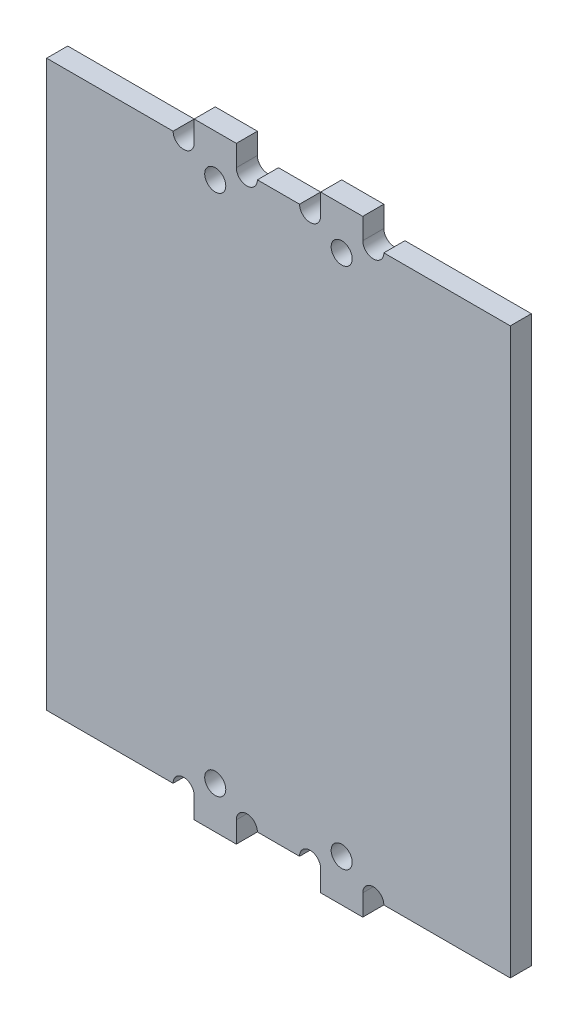
ISO-10303-21;
HEADER;
FILE_DESCRIPTION(('STEP AP214'),'2;1');
FILE_NAME('part.step','',(''),(''),'','','');
FILE_SCHEMA(('AUTOMOTIVE_DESIGN { 1 0 10303 214 1 1 1 1 }'));
ENDSEC;
DATA;
#1=APPLICATION_CONTEXT('core data for automotive mechanical design processes');
#2=APPLICATION_PROTOCOL_DEFINITION('international standard','automotive_design',2000,#1);
#3=PRODUCT_CONTEXT('',#1,'mechanical');
#4=PRODUCT('Part','Part','',(#3));
#5=PRODUCT_RELATED_PRODUCT_CATEGORY('part','',(#4));
#6=PRODUCT_DEFINITION_FORMATION('','',#4);
#7=PRODUCT_DEFINITION_CONTEXT('part definition',#1,'design');
#8=PRODUCT_DEFINITION('design','',#6,#7);
#9=PRODUCT_DEFINITION_SHAPE('','',#8);
#10=(LENGTH_UNIT() NAMED_UNIT(*) SI_UNIT(.MILLI.,.METRE.));
#11=(NAMED_UNIT(*) PLANE_ANGLE_UNIT() SI_UNIT($,.RADIAN.));
#12=(NAMED_UNIT(*) SI_UNIT($,.STERADIAN.) SOLID_ANGLE_UNIT());
#13=UNCERTAINTY_MEASURE_WITH_UNIT(LENGTH_MEASURE(1.E-05),#10,'distance_accuracy_value','');
#14=(GEOMETRIC_REPRESENTATION_CONTEXT(3) GLOBAL_UNCERTAINTY_ASSIGNED_CONTEXT((#13)) GLOBAL_UNIT_ASSIGNED_CONTEXT((#10,
#11,#12)) REPRESENTATION_CONTEXT('',''));
#15=CARTESIAN_POINT('',(0.,0.,0.));
#16=DIRECTION('',(0.,0.,1.));
#17=DIRECTION('',(1.,0.,0.));
#18=AXIS2_PLACEMENT_3D('',#15,#16,#17);
#19=CARTESIAN_POINT('',(-0.655498480536135,26.9798263842106,2.));
#20=DIRECTION('',(0.,0.,-1.));
#21=DIRECTION('',(-1.,0.,0.));
#22=AXIS2_PLACEMENT_3D('',#19,#20,#21);
#23=PLANE('',#22);
#24=DIRECTION('',(-1.,0.,0.));
#25=VECTOR('',#24,1.);
#26=CARTESIAN_POINT('',(-13.6554984805362,26.9798263842106,2.));
#27=LINE('',#26,#25);
#28=CARTESIAN_POINT('',(-1.65549848053614,26.9798263842106,2.));
#29=VERTEX_POINT('',#28);
#30=CARTESIAN_POINT('',(-13.6554984805362,26.9798263842106,2.));
#31=VERTEX_POINT('',#30);
#32=EDGE_CURVE('E49',#29,#31,#27,.T.);
#33=ORIENTED_EDGE('',*,*,#32,.T.);
#34=DIRECTION('',(0.,-1.,0.));
#35=VECTOR('',#34,1.);
#36=CARTESIAN_POINT('',(-13.6554984805362,25.9798263842106,2.));
#37=LINE('',#36,#35);
#38=CARTESIAN_POINT('',(-13.6554984805361,-26.6201736157894,2.));
#39=VERTEX_POINT('',#38);
#40=EDGE_CURVE('E153',#31,#39,#37,.T.);
#41=ORIENTED_EDGE('',*,*,#40,.T.);
#42=DIRECTION('',(1.,0.,0.));
#43=VECTOR('',#42,1.);
#44=CARTESIAN_POINT('',(-13.6554984805361,-26.6201736157894,2.));
#45=LINE('',#44,#43);
#46=CARTESIAN_POINT('',(-1.6554984805362,-26.6201736157894,2.));
#47=VERTEX_POINT('',#46);
#48=EDGE_CURVE('E385',#39,#47,#45,.T.);
#49=ORIENTED_EDGE('',*,*,#48,.T.);
#50=CARTESIAN_POINT('',(-0.655498480536205,-26.6201736157894,2.));
#51=DIRECTION('',(0.,0.,-1.));
#52=DIRECTION('',(1.,0.,0.));
#53=AXIS2_PLACEMENT_3D('',#50,#51,#52);
#54=CIRCLE('',#53,1.);
#55=CARTESIAN_POINT('',(0.344501519463795,-26.6201736157894,2.));
#56=VERTEX_POINT('',#55);
#57=EDGE_CURVE('E400',#47,#56,#54,.T.);
#58=ORIENTED_EDGE('',*,*,#57,.T.);
#59=DIRECTION('',(0.,-1.,0.));
#60=VECTOR('',#59,1.);
#61=CARTESIAN_POINT('',(0.344501519463795,-26.6201736157894,2.));
#62=LINE('',#61,#60);
#63=CARTESIAN_POINT('',(0.344501519463795,-28.6201736157894,2.));
#64=VERTEX_POINT('',#63);
#65=EDGE_CURVE('E402',#56,#64,#62,.T.);
#66=ORIENTED_EDGE('',*,*,#65,.T.);
#67=DIRECTION('',(1.,0.,0.));
#68=VECTOR('',#67,1.);
#69=CARTESIAN_POINT('',(0.344501519463795,-28.6201736157894,2.));
#70=LINE('',#69,#68);
#71=CARTESIAN_POINT('',(4.3445015194638,-28.6201736157894,2.));
#72=VERTEX_POINT('',#71);
#73=EDGE_CURVE('E404',#64,#72,#70,.T.);
#74=ORIENTED_EDGE('',*,*,#73,.T.);
#75=DIRECTION('',(0.,1.,0.));
#76=VECTOR('',#75,1.);
#77=CARTESIAN_POINT('',(4.3445015194638,-26.6201736157894,2.));
#78=LINE('',#77,#76);
#79=CARTESIAN_POINT('',(4.3445015194638,-26.6201736157894,2.));
#80=VERTEX_POINT('',#79);
#81=EDGE_CURVE('E406',#72,#80,#78,.T.);
#82=ORIENTED_EDGE('',*,*,#81,.T.);
#83=CARTESIAN_POINT('',(5.3445015194638,-26.6201736157894,2.));
#84=DIRECTION('',(0.,0.,-1.));
#85=DIRECTION('',(-1.,0.,0.));
#86=AXIS2_PLACEMENT_3D('',#83,#84,#85);
#87=CIRCLE('',#86,1.);
#88=CARTESIAN_POINT('',(6.3445015194638,-26.6201736157894,2.));
#89=VERTEX_POINT('',#88);
#90=EDGE_CURVE('E408',#80,#89,#87,.T.);
#91=ORIENTED_EDGE('',*,*,#90,.T.);
#92=DIRECTION('',(1.,0.,0.));
#93=VECTOR('',#92,1.);
#94=CARTESIAN_POINT('',(6.3445015194638,-26.6201736157894,2.));
#95=LINE('',#94,#93);
#96=CARTESIAN_POINT('',(10.3445015194638,-26.6201736157894,2.));
#97=VERTEX_POINT('',#96);
#98=EDGE_CURVE('E410',#89,#97,#95,.T.);
#99=ORIENTED_EDGE('',*,*,#98,.T.);
#100=CARTESIAN_POINT('',(11.3445015194638,-26.6201736157894,2.));
#101=DIRECTION('',(0.,0.,-1.));
#102=DIRECTION('',(1.,0.,0.));
#103=AXIS2_PLACEMENT_3D('',#100,#101,#102);
#104=CIRCLE('',#103,1.);
#105=CARTESIAN_POINT('',(12.3445015194638,-26.6201736157894,2.));
#106=VERTEX_POINT('',#105);
#107=EDGE_CURVE('E412',#97,#106,#104,.T.);
#108=ORIENTED_EDGE('',*,*,#107,.T.);
#109=DIRECTION('',(0.,-1.,0.));
#110=VECTOR('',#109,1.);
#111=CARTESIAN_POINT('',(12.3445015194638,-26.6201736157894,2.));
#112=LINE('',#111,#110);
#113=CARTESIAN_POINT('',(12.3445015194638,-28.6201736157894,2.));
#114=VERTEX_POINT('',#113);
#115=EDGE_CURVE('E414',#106,#114,#112,.T.);
#116=ORIENTED_EDGE('',*,*,#115,.T.);
#117=DIRECTION('',(1.,0.,0.));
#118=VECTOR('',#117,1.);
#119=CARTESIAN_POINT('',(12.3445015194638,-28.6201736157894,2.));
#120=LINE('',#119,#118);
#121=CARTESIAN_POINT('',(16.3445015194638,-28.6201736157894,2.));
#122=VERTEX_POINT('',#121);
#123=EDGE_CURVE('E416',#114,#122,#120,.T.);
#124=ORIENTED_EDGE('',*,*,#123,.T.);
#125=DIRECTION('',(0.,1.,0.));
#126=VECTOR('',#125,1.);
#127=CARTESIAN_POINT('',(16.3445015194638,-26.6201736157894,2.));
#128=LINE('',#127,#126);
#129=CARTESIAN_POINT('',(16.3445015194638,-26.6201736157894,2.));
#130=VERTEX_POINT('',#129);
#131=EDGE_CURVE('E418',#122,#130,#128,.T.);
#132=ORIENTED_EDGE('',*,*,#131,.T.);
#133=CARTESIAN_POINT('',(17.3445015194638,-26.6201736157894,2.));
#134=DIRECTION('',(0.,0.,-1.));
#135=DIRECTION('',(-1.,0.,0.));
#136=AXIS2_PLACEMENT_3D('',#133,#134,#135);
#137=CIRCLE('',#136,1.);
#138=CARTESIAN_POINT('',(18.3445015194638,-26.6201736157894,2.));
#139=VERTEX_POINT('',#138);
#140=EDGE_CURVE('E420',#130,#139,#137,.T.);
#141=ORIENTED_EDGE('',*,*,#140,.T.);
#142=DIRECTION('',(1.,0.,0.));
#143=VECTOR('',#142,1.);
#144=CARTESIAN_POINT('',(18.3445015194638,-26.6201736157894,2.));
#145=LINE('',#144,#143);
#146=CARTESIAN_POINT('',(30.3445015194639,-26.6201736157894,2.));
#147=VERTEX_POINT('',#146);
#148=EDGE_CURVE('E422',#139,#147,#145,.T.);
#149=ORIENTED_EDGE('',*,*,#148,.T.);
#150=DIRECTION('',(0.,1.,0.));
#151=VECTOR('',#150,1.);
#152=CARTESIAN_POINT('',(30.3445015194639,25.9798263842106,2.));
#153=LINE('',#152,#151);
#154=CARTESIAN_POINT('',(30.3445015194639,26.9798263842106,2.));
#155=VERTEX_POINT('',#154);
#156=EDGE_CURVE('E424',#147,#155,#153,.T.);
#157=ORIENTED_EDGE('',*,*,#156,.T.);
#158=DIRECTION('',(-1.,0.,0.));
#159=VECTOR('',#158,1.);
#160=CARTESIAN_POINT('',(30.3445015194639,26.9798263842106,2.));
#161=LINE('',#160,#159);
#162=CARTESIAN_POINT('',(18.3445015194639,26.9798263842106,2.));
#163=VERTEX_POINT('',#162);
#164=EDGE_CURVE('E426',#155,#163,#161,.T.);
#165=ORIENTED_EDGE('',*,*,#164,.T.);
#166=CARTESIAN_POINT('',(17.3445015194639,26.9798263842106,2.));
#167=DIRECTION('',(0.,0.,-1.));
#168=DIRECTION('',(1.,0.,0.));
#169=AXIS2_PLACEMENT_3D('',#166,#167,#168);
#170=CIRCLE('',#169,0.999999999999999);
#171=CARTESIAN_POINT('',(16.3445015194639,26.9798263842106,2.));
#172=VERTEX_POINT('',#171);
#173=EDGE_CURVE('E428',#163,#172,#170,.T.);
#174=ORIENTED_EDGE('',*,*,#173,.T.);
#175=DIRECTION('',(0.,1.,0.));
#176=VECTOR('',#175,1.);
#177=CARTESIAN_POINT('',(16.3445015194639,26.9798263842106,2.));
#178=LINE('',#177,#176);
#179=CARTESIAN_POINT('',(16.3445015194639,28.9798263842106,2.));
#180=VERTEX_POINT('',#179);
#181=EDGE_CURVE('E430',#172,#180,#178,.T.);
#182=ORIENTED_EDGE('',*,*,#181,.T.);
#183=DIRECTION('',(-1.,0.,0.));
#184=VECTOR('',#183,1.);
#185=CARTESIAN_POINT('',(12.3445015194639,28.9798263842106,2.));
#186=LINE('',#185,#184);
#187=CARTESIAN_POINT('',(12.3445015194639,28.9798263842106,2.));
#188=VERTEX_POINT('',#187);
#189=EDGE_CURVE('E432',#180,#188,#186,.T.);
#190=ORIENTED_EDGE('',*,*,#189,.T.);
#191=DIRECTION('',(0.,-1.,0.));
#192=VECTOR('',#191,1.);
#193=CARTESIAN_POINT('',(12.3445015194639,26.9798263842106,2.));
#194=LINE('',#193,#192);
#195=CARTESIAN_POINT('',(12.3445015194639,26.9798263842106,2.));
#196=VERTEX_POINT('',#195);
#197=EDGE_CURVE('E434',#188,#196,#194,.T.);
#198=ORIENTED_EDGE('',*,*,#197,.T.);
#199=CARTESIAN_POINT('',(11.3445015194639,26.9798263842106,2.));
#200=DIRECTION('',(0.,0.,-1.));
#201=DIRECTION('',(-1.,0.,0.));
#202=AXIS2_PLACEMENT_3D('',#199,#200,#201);
#203=CIRCLE('',#202,1.);
#204=CARTESIAN_POINT('',(10.3445015194639,26.9798263842106,2.));
#205=VERTEX_POINT('',#204);
#206=EDGE_CURVE('E436',#196,#205,#203,.T.);
#207=ORIENTED_EDGE('',*,*,#206,.T.);
#208=DIRECTION('',(-1.,0.,0.));
#209=VECTOR('',#208,1.);
#210=CARTESIAN_POINT('',(6.34450151946386,26.9798263842106,2.));
#211=LINE('',#210,#209);
#212=CARTESIAN_POINT('',(6.34450151946386,26.9798263842106,2.));
#213=VERTEX_POINT('',#212);
#214=EDGE_CURVE('E438',#205,#213,#211,.T.);
#215=ORIENTED_EDGE('',*,*,#214,.T.);
#216=CARTESIAN_POINT('',(5.34450151946386,26.9798263842106,2.));
#217=DIRECTION('',(0.,0.,-1.));
#218=DIRECTION('',(1.,0.,0.));
#219=AXIS2_PLACEMENT_3D('',#216,#217,#218);
#220=CIRCLE('',#219,1.);
#221=CARTESIAN_POINT('',(4.34450151946386,26.9798263842106,2.));
#222=VERTEX_POINT('',#221);
#223=EDGE_CURVE('E440',#213,#222,#220,.T.);
#224=ORIENTED_EDGE('',*,*,#223,.T.);
#225=DIRECTION('',(0.,1.,0.));
#226=VECTOR('',#225,1.);
#227=CARTESIAN_POINT('',(4.34450151946386,26.9798263842106,2.));
#228=LINE('',#227,#226);
#229=CARTESIAN_POINT('',(4.34450151946386,28.9798263842106,2.));
#230=VERTEX_POINT('',#229);
#231=EDGE_CURVE('E233',#222,#230,#228,.T.);
#232=ORIENTED_EDGE('',*,*,#231,.T.);
#233=DIRECTION('',(-1.,0.,0.));
#234=VECTOR('',#233,1.);
#235=CARTESIAN_POINT('',(0.344501519463865,28.9798263842106,2.));
#236=LINE('',#235,#234);
#237=CARTESIAN_POINT('',(0.344501519463865,28.9798263842106,2.));
#238=VERTEX_POINT('',#237);
#239=EDGE_CURVE('E227',#230,#238,#236,.T.);
#240=ORIENTED_EDGE('',*,*,#239,.T.);
#241=DIRECTION('',(0.,-1.,0.));
#242=VECTOR('',#241,1.);
#243=CARTESIAN_POINT('',(0.344501519463865,26.9798263842106,2.));
#244=LINE('',#243,#242);
#245=CARTESIAN_POINT('',(0.344501519463865,26.9798263842106,2.));
#246=VERTEX_POINT('',#245);
#247=EDGE_CURVE('E231',#238,#246,#244,.T.);
#248=ORIENTED_EDGE('',*,*,#247,.T.);
#249=CARTESIAN_POINT('',(-0.655498480536135,26.9798263842106,2.));
#250=DIRECTION('',(0.,0.,-1.));
#251=DIRECTION('',(-1.,0.,0.));
#252=AXIS2_PLACEMENT_3D('',#249,#250,#251);
#253=CIRCLE('',#252,1.);
#254=EDGE_CURVE('E247',#246,#29,#253,.T.);
#255=ORIENTED_EDGE('',*,*,#254,.T.);
#256=EDGE_LOOP('',(#33,#41,#49,#58,#66,#74,#82,#91,#99,#108,#116,#124,#132,#141,#149,#157,#165,
#174,#182,#190,#198,#207,#215,#224,#232,#240,#248,#255));
#257=FACE_BOUND('',#256,.T.);
#258=CARTESIAN_POINT('',(2.34450151946386,24.9798263842106,2.));
#259=DIRECTION('',(0.,0.,1.));
#260=DIRECTION('',(1.,0.,0.));
#261=AXIS2_PLACEMENT_3D('',#258,#259,#260);
#262=CIRCLE('',#261,1.);
#263=CARTESIAN_POINT('',(3.34450151946387,24.9798263842106,2.));
#264=VERTEX_POINT('',#263);
#265=EDGE_CURVE('E257',#264,#264,#262,.T.);
#266=ORIENTED_EDGE('',*,*,#265,.F.);
#267=EDGE_LOOP('',(#266));
#268=FACE_BOUND('',#267,.T.);
#269=CARTESIAN_POINT('',(2.34450151946386,-24.6201736157894,2.));
#270=DIRECTION('',(0.,0.,1.));
#271=DIRECTION('',(1.,0.,0.));
#272=AXIS2_PLACEMENT_3D('',#269,#270,#271);
#273=CIRCLE('',#272,1.);
#274=CARTESIAN_POINT('',(3.34450151946387,-24.6201736157894,2.));
#275=VERTEX_POINT('',#274);
#276=EDGE_CURVE('E860',#275,#275,#273,.T.);
#277=ORIENTED_EDGE('',*,*,#276,.F.);
#278=EDGE_LOOP('',(#277));
#279=FACE_BOUND('',#278,.T.);
#280=CARTESIAN_POINT('',(14.3445015194639,-24.6201736157894,2.));
#281=DIRECTION('',(0.,0.,1.));
#282=DIRECTION('',(1.,0.,0.));
#283=AXIS2_PLACEMENT_3D('',#280,#281,#282);
#284=CIRCLE('',#283,1.);
#285=CARTESIAN_POINT('',(15.3445015194639,-24.6201736157894,2.));
#286=VERTEX_POINT('',#285);
#287=EDGE_CURVE('E854',#286,#286,#284,.T.);
#288=ORIENTED_EDGE('',*,*,#287,.F.);
#289=EDGE_LOOP('',(#288));
#290=FACE_BOUND('',#289,.T.);
#291=CARTESIAN_POINT('',(14.3445015194639,24.9798263842106,2.));
#292=DIRECTION('',(0.,0.,1.));
#293=DIRECTION('',(1.,0.,0.));
#294=AXIS2_PLACEMENT_3D('',#291,#292,#293);
#295=CIRCLE('',#294,1.);
#296=CARTESIAN_POINT('',(15.3445015194639,24.9798263842106,2.));
#297=VERTEX_POINT('',#296);
#298=EDGE_CURVE('E845',#297,#297,#295,.T.);
#299=ORIENTED_EDGE('',*,*,#298,.F.);
#300=EDGE_LOOP('',(#299));
#301=FACE_BOUND('',#300,.T.);
#302=ADVANCED_FACE('F32',(#257,#268,#279,#290,#301),#23,.F.);
#303=CARTESIAN_POINT('',(-0.655498480536135,26.9798263842106,0.));
#304=DIRECTION('',(0.,0.,-1.));
#305=DIRECTION('',(-1.,0.,0.));
#306=AXIS2_PLACEMENT_3D('',#303,#304,#305);
#307=PLANE('',#306);
#308=CARTESIAN_POINT('',(14.3445015194639,-24.6201736157894,0.));
#309=DIRECTION('',(0.,0.,1.));
#310=DIRECTION('',(1.,0.,0.));
#311=AXIS2_PLACEMENT_3D('',#308,#309,#310);
#312=CIRCLE('',#311,1.);
#313=CARTESIAN_POINT('',(15.3445015194639,-24.6201736157894,0.));
#314=VERTEX_POINT('',#313);
#315=EDGE_CURVE('E851',#314,#314,#312,.T.);
#316=ORIENTED_EDGE('',*,*,#315,.T.);
#317=EDGE_LOOP('',(#316));
#318=FACE_BOUND('',#317,.T.);
#319=CARTESIAN_POINT('',(2.34450151946386,24.9798263842106,0.));
#320=DIRECTION('',(0.,0.,1.));
#321=DIRECTION('',(1.,0.,0.));
#322=AXIS2_PLACEMENT_3D('',#319,#320,#321);
#323=CIRCLE('',#322,1.);
#324=CARTESIAN_POINT('',(3.34450151946387,24.9798263842106,0.));
#325=VERTEX_POINT('',#324);
#326=EDGE_CURVE('E396',#325,#325,#323,.T.);
#327=ORIENTED_EDGE('',*,*,#326,.T.);
#328=EDGE_LOOP('',(#327));
#329=FACE_BOUND('',#328,.T.);
#330=DIRECTION('',(0.,-1.,0.));
#331=VECTOR('',#330,1.);
#332=CARTESIAN_POINT('',(-13.6554984805362,25.9798263842106,0.));
#333=LINE('',#332,#331);
#334=CARTESIAN_POINT('',(-13.6554984805362,26.9798263842106,0.));
#335=VERTEX_POINT('',#334);
#336=CARTESIAN_POINT('',(-13.6554984805361,-26.6201736157894,0.));
#337=VERTEX_POINT('',#336);
#338=EDGE_CURVE('E253',#335,#337,#333,.T.);
#339=ORIENTED_EDGE('',*,*,#338,.F.);
#340=DIRECTION('',(-1.,0.,0.));
#341=VECTOR('',#340,1.);
#342=CARTESIAN_POINT('',(-12.6554984805361,26.9798263842106,0.));
#343=LINE('',#342,#341);
#344=CARTESIAN_POINT('',(-1.65549848053614,26.9798263842106,0.));
#345=VERTEX_POINT('',#344);
#346=EDGE_CURVE('E309',#345,#335,#343,.T.);
#347=ORIENTED_EDGE('',*,*,#346,.F.);
#348=CARTESIAN_POINT('',(-0.655498480536135,26.9798263842106,0.));
#349=DIRECTION('',(0.,0.,-1.));
#350=DIRECTION('',(-1.,0.,0.));
#351=AXIS2_PLACEMENT_3D('',#348,#349,#350);
#352=CIRCLE('',#351,1.);
#353=CARTESIAN_POINT('',(0.344501519463865,26.9798263842106,0.));
#354=VERTEX_POINT('',#353);
#355=EDGE_CURVE('E146',#354,#345,#352,.T.);
#356=ORIENTED_EDGE('',*,*,#355,.F.);
#357=DIRECTION('',(0.,-1.,0.));
#358=VECTOR('',#357,1.);
#359=CARTESIAN_POINT('',(0.344501519463865,26.9798263842106,0.));
#360=LINE('',#359,#358);
#361=CARTESIAN_POINT('',(0.344501519463865,28.9798263842106,0.));
#362=VERTEX_POINT('',#361);
#363=EDGE_CURVE('E139',#362,#354,#360,.T.);
#364=ORIENTED_EDGE('',*,*,#363,.F.);
#365=DIRECTION('',(-1.,0.,0.));
#366=VECTOR('',#365,1.);
#367=CARTESIAN_POINT('',(0.344501519463865,28.9798263842106,0.));
#368=LINE('',#367,#366);
#369=CARTESIAN_POINT('',(4.34450151946386,28.9798263842106,0.));
#370=VERTEX_POINT('',#369);
#371=EDGE_CURVE('E241',#370,#362,#368,.T.);
#372=ORIENTED_EDGE('',*,*,#371,.F.);
#373=DIRECTION('',(0.,1.,0.));
#374=VECTOR('',#373,1.);
#375=CARTESIAN_POINT('',(4.34450151946386,26.9798263842106,0.));
#376=LINE('',#375,#374);
#377=CARTESIAN_POINT('',(4.34450151946386,26.9798263842106,0.));
#378=VERTEX_POINT('',#377);
#379=EDGE_CURVE('E304',#378,#370,#376,.T.);
#380=ORIENTED_EDGE('',*,*,#379,.F.);
#381=CARTESIAN_POINT('',(5.34450151946386,26.9798263842106,0.));
#382=DIRECTION('',(0.,0.,-1.));
#383=DIRECTION('',(1.,0.,0.));
#384=AXIS2_PLACEMENT_3D('',#381,#382,#383);
#385=CIRCLE('',#384,1.);
#386=CARTESIAN_POINT('',(6.34450151946386,26.9798263842106,0.));
#387=VERTEX_POINT('',#386);
#388=EDGE_CURVE('E302',#387,#378,#385,.T.);
#389=ORIENTED_EDGE('',*,*,#388,.F.);
#390=DIRECTION('',(-1.,0.,0.));
#391=VECTOR('',#390,1.);
#392=CARTESIAN_POINT('',(6.34450151946386,26.9798263842106,0.));
#393=LINE('',#392,#391);
#394=CARTESIAN_POINT('',(10.3445015194639,26.9798263842106,0.));
#395=VERTEX_POINT('',#394);
#396=EDGE_CURVE('E300',#395,#387,#393,.T.);
#397=ORIENTED_EDGE('',*,*,#396,.F.);
#398=CARTESIAN_POINT('',(11.3445015194639,26.9798263842106,0.));
#399=DIRECTION('',(0.,0.,-1.));
#400=DIRECTION('',(-1.,0.,0.));
#401=AXIS2_PLACEMENT_3D('',#398,#399,#400);
#402=CIRCLE('',#401,1.);
#403=CARTESIAN_POINT('',(12.3445015194639,26.9798263842106,0.));
#404=VERTEX_POINT('',#403);
#405=EDGE_CURVE('E298',#404,#395,#402,.T.);
#406=ORIENTED_EDGE('',*,*,#405,.F.);
#407=DIRECTION('',(0.,-1.,0.));
#408=VECTOR('',#407,1.);
#409=CARTESIAN_POINT('',(12.3445015194639,26.9798263842106,0.));
#410=LINE('',#409,#408);
#411=CARTESIAN_POINT('',(12.3445015194639,28.9798263842106,0.));
#412=VERTEX_POINT('',#411);
#413=EDGE_CURVE('E296',#412,#404,#410,.T.);
#414=ORIENTED_EDGE('',*,*,#413,.F.);
#415=DIRECTION('',(-1.,0.,0.));
#416=VECTOR('',#415,1.);
#417=CARTESIAN_POINT('',(12.3445015194639,28.9798263842106,0.));
#418=LINE('',#417,#416);
#419=CARTESIAN_POINT('',(16.3445015194639,28.9798263842106,0.));
#420=VERTEX_POINT('',#419);
#421=EDGE_CURVE('E294',#420,#412,#418,.T.);
#422=ORIENTED_EDGE('',*,*,#421,.F.);
#423=DIRECTION('',(0.,1.,0.));
#424=VECTOR('',#423,1.);
#425=CARTESIAN_POINT('',(16.3445015194639,26.9798263842106,0.));
#426=LINE('',#425,#424);
#427=CARTESIAN_POINT('',(16.3445015194639,26.9798263842106,0.));
#428=VERTEX_POINT('',#427);
#429=EDGE_CURVE('E292',#428,#420,#426,.T.);
#430=ORIENTED_EDGE('',*,*,#429,.F.);
#431=CARTESIAN_POINT('',(17.3445015194639,26.9798263842106,0.));
#432=DIRECTION('',(0.,0.,-1.));
#433=DIRECTION('',(1.,0.,0.));
#434=AXIS2_PLACEMENT_3D('',#431,#432,#433);
#435=CIRCLE('',#434,0.999999999999999);
#436=CARTESIAN_POINT('',(18.3445015194639,26.9798263842106,0.));
#437=VERTEX_POINT('',#436);
#438=EDGE_CURVE('E290',#437,#428,#435,.T.);
#439=ORIENTED_EDGE('',*,*,#438,.F.);
#440=DIRECTION('',(-1.,0.,0.));
#441=VECTOR('',#440,1.);
#442=CARTESIAN_POINT('',(18.3445015194639,26.9798263842106,0.));
#443=LINE('',#442,#441);
#444=CARTESIAN_POINT('',(30.3445015194639,26.9798263842106,0.));
#445=VERTEX_POINT('',#444);
#446=EDGE_CURVE('E288',#445,#437,#443,.T.);
#447=ORIENTED_EDGE('',*,*,#446,.F.);
#448=DIRECTION('',(0.,1.,0.));
#449=VECTOR('',#448,1.);
#450=CARTESIAN_POINT('',(30.3445015194639,25.9798263842106,0.));
#451=LINE('',#450,#449);
#452=CARTESIAN_POINT('',(30.3445015194639,-26.6201736157894,0.));
#453=VERTEX_POINT('',#452);
#454=EDGE_CURVE('E285',#453,#445,#451,.T.);
#455=ORIENTED_EDGE('',*,*,#454,.F.);
#456=DIRECTION('',(1.,0.,0.));
#457=VECTOR('',#456,1.);
#458=CARTESIAN_POINT('',(30.3445015194639,-26.6201736157894,0.));
#459=LINE('',#458,#457);
#460=CARTESIAN_POINT('',(18.3445015194638,-26.6201736157894,0.));
#461=VERTEX_POINT('',#460);
#462=EDGE_CURVE('E282',#461,#453,#459,.T.);
#463=ORIENTED_EDGE('',*,*,#462,.F.);
#464=CARTESIAN_POINT('',(17.3445015194638,-26.6201736157894,0.));
#465=DIRECTION('',(0.,0.,-1.));
#466=DIRECTION('',(-1.,0.,0.));
#467=AXIS2_PLACEMENT_3D('',#464,#465,#466);
#468=CIRCLE('',#467,1.);
#469=CARTESIAN_POINT('',(16.3445015194638,-26.6201736157894,0.));
#470=VERTEX_POINT('',#469);
#471=EDGE_CURVE('E279',#470,#461,#468,.T.);
#472=ORIENTED_EDGE('',*,*,#471,.F.);
#473=DIRECTION('',(0.,1.,0.));
#474=VECTOR('',#473,1.);
#475=CARTESIAN_POINT('',(16.3445015194638,-26.6201736157894,0.));
#476=LINE('',#475,#474);
#477=CARTESIAN_POINT('',(16.3445015194638,-28.6201736157894,0.));
#478=VERTEX_POINT('',#477);
#479=EDGE_CURVE('E277',#478,#470,#476,.T.);
#480=ORIENTED_EDGE('',*,*,#479,.F.);
#481=DIRECTION('',(1.,0.,0.));
#482=VECTOR('',#481,1.);
#483=CARTESIAN_POINT('',(12.3445015194638,-28.6201736157894,0.));
#484=LINE('',#483,#482);
#485=CARTESIAN_POINT('',(12.3445015194638,-28.6201736157894,0.));
#486=VERTEX_POINT('',#485);
#487=EDGE_CURVE('E275',#486,#478,#484,.T.);
#488=ORIENTED_EDGE('',*,*,#487,.F.);
#489=DIRECTION('',(0.,-1.,0.));
#490=VECTOR('',#489,1.);
#491=CARTESIAN_POINT('',(12.3445015194638,-26.6201736157894,0.));
#492=LINE('',#491,#490);
#493=CARTESIAN_POINT('',(12.3445015194638,-26.6201736157894,0.));
#494=VERTEX_POINT('',#493);
#495=EDGE_CURVE('E273',#494,#486,#492,.T.);
#496=ORIENTED_EDGE('',*,*,#495,.F.);
#497=CARTESIAN_POINT('',(11.3445015194638,-26.6201736157894,0.));
#498=DIRECTION('',(0.,0.,-1.));
#499=DIRECTION('',(1.,0.,0.));
#500=AXIS2_PLACEMENT_3D('',#497,#498,#499);
#501=CIRCLE('',#500,1.);
#502=CARTESIAN_POINT('',(10.3445015194638,-26.6201736157894,0.));
#503=VERTEX_POINT('',#502);
#504=EDGE_CURVE('E271',#503,#494,#501,.T.);
#505=ORIENTED_EDGE('',*,*,#504,.F.);
#506=DIRECTION('',(1.,0.,0.));
#507=VECTOR('',#506,1.);
#508=CARTESIAN_POINT('',(6.3445015194638,-26.6201736157894,0.));
#509=LINE('',#508,#507);
#510=CARTESIAN_POINT('',(6.3445015194638,-26.6201736157894,0.));
#511=VERTEX_POINT('',#510);
#512=EDGE_CURVE('E269',#511,#503,#509,.T.);
#513=ORIENTED_EDGE('',*,*,#512,.F.);
#514=CARTESIAN_POINT('',(5.3445015194638,-26.6201736157894,0.));
#515=DIRECTION('',(0.,0.,-1.));
#516=DIRECTION('',(-1.,0.,0.));
#517=AXIS2_PLACEMENT_3D('',#514,#515,#516);
#518=CIRCLE('',#517,1.);
#519=CARTESIAN_POINT('',(4.3445015194638,-26.6201736157894,0.));
#520=VERTEX_POINT('',#519);
#521=EDGE_CURVE('E267',#520,#511,#518,.T.);
#522=ORIENTED_EDGE('',*,*,#521,.F.);
#523=DIRECTION('',(0.,1.,0.));
#524=VECTOR('',#523,1.);
#525=CARTESIAN_POINT('',(4.3445015194638,-26.6201736157894,0.));
#526=LINE('',#525,#524);
#527=CARTESIAN_POINT('',(4.3445015194638,-28.6201736157894,0.));
#528=VERTEX_POINT('',#527);
#529=EDGE_CURVE('E265',#528,#520,#526,.T.);
#530=ORIENTED_EDGE('',*,*,#529,.F.);
#531=DIRECTION('',(1.,0.,0.));
#532=VECTOR('',#531,1.);
#533=CARTESIAN_POINT('',(0.344501519463795,-28.6201736157894,0.));
#534=LINE('',#533,#532);
#535=CARTESIAN_POINT('',(0.344501519463795,-28.6201736157894,0.));
#536=VERTEX_POINT('',#535);
#537=EDGE_CURVE('E263',#536,#528,#534,.T.);
#538=ORIENTED_EDGE('',*,*,#537,.F.);
#539=DIRECTION('',(0.,-1.,0.));
#540=VECTOR('',#539,1.);
#541=CARTESIAN_POINT('',(0.344501519463795,-26.6201736157894,0.));
#542=LINE('',#541,#540);
#543=CARTESIAN_POINT('',(0.344501519463795,-26.6201736157894,0.));
#544=VERTEX_POINT('',#543);
#545=EDGE_CURVE('E261',#544,#536,#542,.T.);
#546=ORIENTED_EDGE('',*,*,#545,.F.);
#547=CARTESIAN_POINT('',(-0.655498480536205,-26.6201736157894,0.));
#548=DIRECTION('',(0.,0.,-1.));
#549=DIRECTION('',(1.,0.,0.));
#550=AXIS2_PLACEMENT_3D('',#547,#548,#549);
#551=CIRCLE('',#550,1.);
#552=CARTESIAN_POINT('',(-1.6554984805362,-26.6201736157894,0.));
#553=VERTEX_POINT('',#552);
#554=EDGE_CURVE('E259',#553,#544,#551,.T.);
#555=ORIENTED_EDGE('',*,*,#554,.F.);
#556=DIRECTION('',(1.,0.,0.));
#557=VECTOR('',#556,1.);
#558=CARTESIAN_POINT('',(-12.6554984805361,-26.6201736157894,0.));
#559=LINE('',#558,#557);
#560=EDGE_CURVE('E256',#337,#553,#559,.T.);
#561=ORIENTED_EDGE('',*,*,#560,.F.);
#562=EDGE_LOOP('',(#339,#347,#356,#364,#372,#380,#389,#397,#406,#414,#422,#430,#439,#447,#455,
#463,#472,#480,#488,#496,#505,#513,#522,#530,#538,#546,#555,#561));
#563=FACE_BOUND('',#562,.T.);
#564=CARTESIAN_POINT('',(2.34450151946386,-24.6201736157894,0.));
#565=DIRECTION('',(0.,0.,1.));
#566=DIRECTION('',(1.,0.,0.));
#567=AXIS2_PLACEMENT_3D('',#564,#565,#566);
#568=CIRCLE('',#567,1.);
#569=CARTESIAN_POINT('',(3.34450151946387,-24.6201736157894,0.));
#570=VERTEX_POINT('',#569);
#571=EDGE_CURVE('E857',#570,#570,#568,.T.);
#572=ORIENTED_EDGE('',*,*,#571,.T.);
#573=EDGE_LOOP('',(#572));
#574=FACE_BOUND('',#573,.T.);
#575=CARTESIAN_POINT('',(14.3445015194639,24.9798263842106,0.));
#576=DIRECTION('',(0.,0.,1.));
#577=DIRECTION('',(1.,0.,0.));
#578=AXIS2_PLACEMENT_3D('',#575,#576,#577);
#579=CIRCLE('',#578,1.);
#580=CARTESIAN_POINT('',(15.3445015194639,24.9798263842106,0.));
#581=VERTEX_POINT('',#580);
#582=EDGE_CURVE('E848',#581,#581,#579,.T.);
#583=ORIENTED_EDGE('',*,*,#582,.T.);
#584=EDGE_LOOP('',(#583));
#585=FACE_BOUND('',#584,.T.);
#586=ADVANCED_FACE('F388',(#318,#329,#563,#574,#585),#307,.T.);
#587=CARTESIAN_POINT('',(-13.6554984805362,25.9798263842106,2.));
#588=DIRECTION('',(1.,0.,0.));
#589=DIRECTION('',(0.,1.,0.));
#590=AXIS2_PLACEMENT_3D('',#587,#588,#589);
#591=PLANE('',#590);
#592=ORIENTED_EDGE('',*,*,#338,.T.);
#593=DIRECTION('',(0.,0.,-1.));
#594=VECTOR('',#593,1.);
#595=CARTESIAN_POINT('',(-13.6554984805361,-26.6201736157894,2.));
#596=LINE('',#595,#594);
#597=EDGE_CURVE('E41',#39,#337,#596,.T.);
#598=ORIENTED_EDGE('',*,*,#597,.F.);
#599=ORIENTED_EDGE('',*,*,#40,.F.);
#600=DIRECTION('',(0.,0.,-1.));
#601=VECTOR('',#600,1.);
#602=CARTESIAN_POINT('',(-13.6554984805362,26.9798263842106,2.));
#603=LINE('',#602,#601);
#604=EDGE_CURVE('E11',#31,#335,#603,.T.);
#605=ORIENTED_EDGE('',*,*,#604,.T.);
#606=EDGE_LOOP('',(#592,#598,#599,#605));
#607=FACE_BOUND('',#606,.T.);
#608=ADVANCED_FACE('F34',(#607),#591,.F.);
#609=CARTESIAN_POINT('',(-12.6554984805361,-26.6201736157894,2.));
#610=DIRECTION('',(0.,1.,0.));
#611=DIRECTION('',(0.,0.,1.));
#612=AXIS2_PLACEMENT_3D('',#609,#610,#611);
#613=PLANE('',#612);
#614=ORIENTED_EDGE('',*,*,#560,.T.);
#615=DIRECTION('',(0.,0.,-1.));
#616=VECTOR('',#615,1.);
#617=CARTESIAN_POINT('',(-1.6554984805362,-26.6201736157894,2.));
#618=LINE('',#617,#616);
#619=EDGE_CURVE('E378',#47,#553,#618,.T.);
#620=ORIENTED_EDGE('',*,*,#619,.F.);
#621=ORIENTED_EDGE('',*,*,#48,.F.);
#622=ORIENTED_EDGE('',*,*,#597,.T.);
#623=EDGE_LOOP('',(#614,#620,#621,#622));
#624=FACE_BOUND('',#623,.T.);
#625=ADVANCED_FACE('F383',(#624),#613,.F.);
#626=CARTESIAN_POINT('',(-0.655498480536205,-26.6201736157894,2.));
#627=DIRECTION('',(0.,0.,-1.));
#628=DIRECTION('',(-1.,0.,0.));
#629=AXIS2_PLACEMENT_3D('',#626,#627,#628);
#630=CYLINDRICAL_SURFACE('',#629,1.);
#631=ORIENTED_EDGE('',*,*,#554,.T.);
#632=DIRECTION('',(0.,0.,-1.));
#633=VECTOR('',#632,1.);
#634=CARTESIAN_POINT('',(0.344501519463795,-26.6201736157894,2.));
#635=LINE('',#634,#633);
#636=EDGE_CURVE('E375',#56,#544,#635,.T.);
#637=ORIENTED_EDGE('',*,*,#636,.F.);
#638=ORIENTED_EDGE('',*,*,#57,.F.);
#639=ORIENTED_EDGE('',*,*,#619,.T.);
#640=EDGE_LOOP('',(#631,#637,#638,#639));
#641=FACE_BOUND('',#640,.T.);
#642=ADVANCED_FACE('F544',(#641),#630,.F.);
#643=CARTESIAN_POINT('',(0.344501519463795,-26.6201736157894,2.));
#644=DIRECTION('',(1.,0.,0.));
#645=DIRECTION('',(0.,0.,-1.));
#646=AXIS2_PLACEMENT_3D('',#643,#644,#645);
#647=PLANE('',#646);
#648=ORIENTED_EDGE('',*,*,#545,.T.);
#649=DIRECTION('',(0.,0.,-1.));
#650=VECTOR('',#649,1.);
#651=CARTESIAN_POINT('',(0.344501519463795,-28.6201736157894,2.));
#652=LINE('',#651,#650);
#653=EDGE_CURVE('E372',#64,#536,#652,.T.);
#654=ORIENTED_EDGE('',*,*,#653,.F.);
#655=ORIENTED_EDGE('',*,*,#65,.F.);
#656=ORIENTED_EDGE('',*,*,#636,.T.);
#657=EDGE_LOOP('',(#648,#654,#655,#656));
#658=FACE_BOUND('',#657,.T.);
#659=ADVANCED_FACE('F540',(#658),#647,.F.);
#660=CARTESIAN_POINT('',(0.344501519463795,-28.6201736157894,2.));
#661=DIRECTION('',(0.,1.,0.));
#662=DIRECTION('',(0.,0.,1.));
#663=AXIS2_PLACEMENT_3D('',#660,#661,#662);
#664=PLANE('',#663);
#665=ORIENTED_EDGE('',*,*,#537,.T.);
#666=DIRECTION('',(0.,0.,-1.));
#667=VECTOR('',#666,1.);
#668=CARTESIAN_POINT('',(4.3445015194638,-28.6201736157894,2.));
#669=LINE('',#668,#667);
#670=EDGE_CURVE('E369',#72,#528,#669,.T.);
#671=ORIENTED_EDGE('',*,*,#670,.F.);
#672=ORIENTED_EDGE('',*,*,#73,.F.);
#673=ORIENTED_EDGE('',*,*,#653,.T.);
#674=EDGE_LOOP('',(#665,#671,#672,#673));
#675=FACE_BOUND('',#674,.T.);
#676=ADVANCED_FACE('F535',(#675),#664,.F.);
#677=CARTESIAN_POINT('',(4.3445015194638,-26.6201736157894,2.));
#678=DIRECTION('',(-1.,0.,0.));
#679=DIRECTION('',(0.,0.,1.));
#680=AXIS2_PLACEMENT_3D('',#677,#678,#679);
#681=PLANE('',#680);
#682=ORIENTED_EDGE('',*,*,#529,.T.);
#683=DIRECTION('',(0.,0.,-1.));
#684=VECTOR('',#683,1.);
#685=CARTESIAN_POINT('',(4.3445015194638,-26.6201736157894,2.));
#686=LINE('',#685,#684);
#687=EDGE_CURVE('E366',#80,#520,#686,.T.);
#688=ORIENTED_EDGE('',*,*,#687,.F.);
#689=ORIENTED_EDGE('',*,*,#81,.F.);
#690=ORIENTED_EDGE('',*,*,#670,.T.);
#691=EDGE_LOOP('',(#682,#688,#689,#690));
#692=FACE_BOUND('',#691,.T.);
#693=ADVANCED_FACE('F530',(#692),#681,.F.);
#694=CARTESIAN_POINT('',(5.3445015194638,-26.6201736157894,2.));
#695=DIRECTION('',(0.,0.,-1.));
#696=DIRECTION('',(-1.,0.,0.));
#697=AXIS2_PLACEMENT_3D('',#694,#695,#696);
#698=CYLINDRICAL_SURFACE('',#697,1.);
#699=ORIENTED_EDGE('',*,*,#521,.T.);
#700=DIRECTION('',(0.,0.,-1.));
#701=VECTOR('',#700,1.);
#702=CARTESIAN_POINT('',(6.3445015194638,-26.6201736157894,2.));
#703=LINE('',#702,#701);
#704=EDGE_CURVE('E363',#89,#511,#703,.T.);
#705=ORIENTED_EDGE('',*,*,#704,.F.);
#706=ORIENTED_EDGE('',*,*,#90,.F.);
#707=ORIENTED_EDGE('',*,*,#687,.T.);
#708=EDGE_LOOP('',(#699,#705,#706,#707));
#709=FACE_BOUND('',#708,.T.);
#710=ADVANCED_FACE('F526',(#709),#698,.F.);
#711=CARTESIAN_POINT('',(6.3445015194638,-26.6201736157894,2.));
#712=DIRECTION('',(0.,1.,0.));
#713=DIRECTION('',(0.,0.,1.));
#714=AXIS2_PLACEMENT_3D('',#711,#712,#713);
#715=PLANE('',#714);
#716=ORIENTED_EDGE('',*,*,#512,.T.);
#717=DIRECTION('',(0.,0.,-1.));
#718=VECTOR('',#717,1.);
#719=CARTESIAN_POINT('',(10.3445015194638,-26.6201736157894,2.));
#720=LINE('',#719,#718);
#721=EDGE_CURVE('E360',#97,#503,#720,.T.);
#722=ORIENTED_EDGE('',*,*,#721,.F.);
#723=ORIENTED_EDGE('',*,*,#98,.F.);
#724=ORIENTED_EDGE('',*,*,#704,.T.);
#725=EDGE_LOOP('',(#716,#722,#723,#724));
#726=FACE_BOUND('',#725,.T.);
#727=ADVANCED_FACE('F521',(#726),#715,.F.);
#728=CARTESIAN_POINT('',(11.3445015194638,-26.6201736157894,2.));
#729=DIRECTION('',(0.,0.,-1.));
#730=DIRECTION('',(-1.,0.,0.));
#731=AXIS2_PLACEMENT_3D('',#728,#729,#730);
#732=CYLINDRICAL_SURFACE('',#731,1.);
#733=ORIENTED_EDGE('',*,*,#504,.T.);
#734=DIRECTION('',(0.,0.,-1.));
#735=VECTOR('',#734,1.);
#736=CARTESIAN_POINT('',(12.3445015194638,-26.6201736157894,2.));
#737=LINE('',#736,#735);
#738=EDGE_CURVE('E357',#106,#494,#737,.T.);
#739=ORIENTED_EDGE('',*,*,#738,.F.);
#740=ORIENTED_EDGE('',*,*,#107,.F.);
#741=ORIENTED_EDGE('',*,*,#721,.T.);
#742=EDGE_LOOP('',(#733,#739,#740,#741));
#743=FACE_BOUND('',#742,.T.);
#744=ADVANCED_FACE('F515',(#743),#732,.F.);
#745=CARTESIAN_POINT('',(12.3445015194638,-26.6201736157894,2.));
#746=DIRECTION('',(1.,0.,0.));
#747=DIRECTION('',(0.,0.,-1.));
#748=AXIS2_PLACEMENT_3D('',#745,#746,#747);
#749=PLANE('',#748);
#750=ORIENTED_EDGE('',*,*,#495,.T.);
#751=DIRECTION('',(0.,0.,-1.));
#752=VECTOR('',#751,1.);
#753=CARTESIAN_POINT('',(12.3445015194638,-28.6201736157894,2.));
#754=LINE('',#753,#752);
#755=EDGE_CURVE('E354',#114,#486,#754,.T.);
#756=ORIENTED_EDGE('',*,*,#755,.F.);
#757=ORIENTED_EDGE('',*,*,#115,.F.);
#758=ORIENTED_EDGE('',*,*,#738,.T.);
#759=EDGE_LOOP('',(#750,#756,#757,#758));
#760=FACE_BOUND('',#759,.T.);
#761=ADVANCED_FACE('F511',(#760),#749,.F.);
#762=CARTESIAN_POINT('',(12.3445015194638,-28.6201736157894,2.));
#763=DIRECTION('',(0.,1.,0.));
#764=DIRECTION('',(0.,0.,1.));
#765=AXIS2_PLACEMENT_3D('',#762,#763,#764);
#766=PLANE('',#765);
#767=ORIENTED_EDGE('',*,*,#487,.T.);
#768=DIRECTION('',(0.,0.,-1.));
#769=VECTOR('',#768,1.);
#770=CARTESIAN_POINT('',(16.3445015194638,-28.6201736157894,2.));
#771=LINE('',#770,#769);
#772=EDGE_CURVE('E351',#122,#478,#771,.T.);
#773=ORIENTED_EDGE('',*,*,#772,.F.);
#774=ORIENTED_EDGE('',*,*,#123,.F.);
#775=ORIENTED_EDGE('',*,*,#755,.T.);
#776=EDGE_LOOP('',(#767,#773,#774,#775));
#777=FACE_BOUND('',#776,.T.);
#778=ADVANCED_FACE('F506',(#777),#766,.F.);
#779=CARTESIAN_POINT('',(16.3445015194638,-26.6201736157894,2.));
#780=DIRECTION('',(-1.,0.,0.));
#781=DIRECTION('',(0.,0.,1.));
#782=AXIS2_PLACEMENT_3D('',#779,#780,#781);
#783=PLANE('',#782);
#784=ORIENTED_EDGE('',*,*,#479,.T.);
#785=DIRECTION('',(0.,0.,-1.));
#786=VECTOR('',#785,1.);
#787=CARTESIAN_POINT('',(16.3445015194638,-26.6201736157894,2.));
#788=LINE('',#787,#786);
#789=EDGE_CURVE('E348',#130,#470,#788,.T.);
#790=ORIENTED_EDGE('',*,*,#789,.F.);
#791=ORIENTED_EDGE('',*,*,#131,.F.);
#792=ORIENTED_EDGE('',*,*,#772,.T.);
#793=EDGE_LOOP('',(#784,#790,#791,#792));
#794=FACE_BOUND('',#793,.T.);
#795=ADVANCED_FACE('F500',(#794),#783,.F.);
#796=CARTESIAN_POINT('',(17.3445015194638,-26.6201736157894,2.));
#797=DIRECTION('',(0.,0.,-1.));
#798=DIRECTION('',(-1.,0.,0.));
#799=AXIS2_PLACEMENT_3D('',#796,#797,#798);
#800=CYLINDRICAL_SURFACE('',#799,1.);
#801=ORIENTED_EDGE('',*,*,#471,.T.);
#802=DIRECTION('',(0.,0.,-1.));
#803=VECTOR('',#802,1.);
#804=CARTESIAN_POINT('',(18.3445015194638,-26.6201736157894,2.));
#805=LINE('',#804,#803);
#806=EDGE_CURVE('E345',#139,#461,#805,.T.);
#807=ORIENTED_EDGE('',*,*,#806,.F.);
#808=ORIENTED_EDGE('',*,*,#140,.F.);
#809=ORIENTED_EDGE('',*,*,#789,.T.);
#810=EDGE_LOOP('',(#801,#807,#808,#809));
#811=FACE_BOUND('',#810,.T.);
#812=ADVANCED_FACE('F496',(#811),#800,.F.);
#813=CARTESIAN_POINT('',(30.3445015194639,-26.6201736157894,2.));
#814=DIRECTION('',(0.,1.,0.));
#815=DIRECTION('',(0.,0.,1.));
#816=AXIS2_PLACEMENT_3D('',#813,#814,#815);
#817=PLANE('',#816);
#818=ORIENTED_EDGE('',*,*,#462,.T.);
#819=DIRECTION('',(0.,0.,-1.));
#820=VECTOR('',#819,1.);
#821=CARTESIAN_POINT('',(30.3445015194639,-26.6201736157894,2.));
#822=LINE('',#821,#820);
#823=EDGE_CURVE('E342',#147,#453,#822,.T.);
#824=ORIENTED_EDGE('',*,*,#823,.F.);
#825=ORIENTED_EDGE('',*,*,#148,.F.);
#826=ORIENTED_EDGE('',*,*,#806,.T.);
#827=EDGE_LOOP('',(#818,#824,#825,#826));
#828=FACE_BOUND('',#827,.T.);
#829=ADVANCED_FACE('F492',(#828),#817,.F.);
#830=CARTESIAN_POINT('',(30.3445015194639,25.9798263842106,2.));
#831=DIRECTION('',(-1.,0.,0.));
#832=DIRECTION('',(0.,0.,1.));
#833=AXIS2_PLACEMENT_3D('',#830,#831,#832);
#834=PLANE('',#833);
#835=ORIENTED_EDGE('',*,*,#454,.T.);
#836=DIRECTION('',(0.,0.,-1.));
#837=VECTOR('',#836,1.);
#838=CARTESIAN_POINT('',(30.3445015194639,26.9798263842106,2.));
#839=LINE('',#838,#837);
#840=EDGE_CURVE('E339',#155,#445,#839,.T.);
#841=ORIENTED_EDGE('',*,*,#840,.F.);
#842=ORIENTED_EDGE('',*,*,#156,.F.);
#843=ORIENTED_EDGE('',*,*,#823,.T.);
#844=EDGE_LOOP('',(#835,#841,#842,#843));
#845=FACE_BOUND('',#844,.T.);
#846=ADVANCED_FACE('F483',(#845),#834,.F.);
#847=CARTESIAN_POINT('',(18.3445015194639,26.9798263842106,2.));
#848=DIRECTION('',(0.,-1.,0.));
#849=DIRECTION('',(1.,0.,0.));
#850=AXIS2_PLACEMENT_3D('',#847,#848,#849);
#851=PLANE('',#850);
#852=ORIENTED_EDGE('',*,*,#446,.T.);
#853=DIRECTION('',(0.,0.,-1.));
#854=VECTOR('',#853,1.);
#855=CARTESIAN_POINT('',(18.3445015194639,26.9798263842106,2.));
#856=LINE('',#855,#854);
#857=EDGE_CURVE('E336',#163,#437,#856,.T.);
#858=ORIENTED_EDGE('',*,*,#857,.F.);
#859=ORIENTED_EDGE('',*,*,#164,.F.);
#860=ORIENTED_EDGE('',*,*,#840,.T.);
#861=EDGE_LOOP('',(#852,#858,#859,#860));
#862=FACE_BOUND('',#861,.T.);
#863=ADVANCED_FACE('F487',(#862),#851,.F.);
#864=CARTESIAN_POINT('',(17.3445015194639,26.9798263842106,2.));
#865=DIRECTION('',(0.,0.,-1.));
#866=DIRECTION('',(-1.,0.,0.));
#867=AXIS2_PLACEMENT_3D('',#864,#865,#866);
#868=CYLINDRICAL_SURFACE('',#867,0.999999999999999);
#869=ORIENTED_EDGE('',*,*,#438,.T.);
#870=DIRECTION('',(0.,0.,-1.));
#871=VECTOR('',#870,1.);
#872=CARTESIAN_POINT('',(16.3445015194639,26.9798263842106,2.));
#873=LINE('',#872,#871);
#874=EDGE_CURVE('E333',#172,#428,#873,.T.);
#875=ORIENTED_EDGE('',*,*,#874,.F.);
#876=ORIENTED_EDGE('',*,*,#173,.F.);
#877=ORIENTED_EDGE('',*,*,#857,.T.);
#878=EDGE_LOOP('',(#869,#875,#876,#877));
#879=FACE_BOUND('',#878,.T.);
#880=ADVANCED_FACE('F478',(#879),#868,.F.);
#881=CARTESIAN_POINT('',(16.3445015194639,26.9798263842106,2.));
#882=DIRECTION('',(-1.,0.,0.));
#883=DIRECTION('',(0.,0.,1.));
#884=AXIS2_PLACEMENT_3D('',#881,#882,#883);
#885=PLANE('',#884);
#886=ORIENTED_EDGE('',*,*,#429,.T.);
#887=DIRECTION('',(0.,0.,-1.));
#888=VECTOR('',#887,1.);
#889=CARTESIAN_POINT('',(16.3445015194639,28.9798263842106,2.));
#890=LINE('',#889,#888);
#891=EDGE_CURVE('E330',#180,#420,#890,.T.);
#892=ORIENTED_EDGE('',*,*,#891,.F.);
#893=ORIENTED_EDGE('',*,*,#181,.F.);
#894=ORIENTED_EDGE('',*,*,#874,.T.);
#895=EDGE_LOOP('',(#886,#892,#893,#894));
#896=FACE_BOUND('',#895,.T.);
#897=ADVANCED_FACE('F474',(#896),#885,.F.);
#898=CARTESIAN_POINT('',(12.3445015194639,28.9798263842106,2.));
#899=DIRECTION('',(0.,-1.,0.));
#900=DIRECTION('',(0.,0.,-1.));
#901=AXIS2_PLACEMENT_3D('',#898,#899,#900);
#902=PLANE('',#901);
#903=ORIENTED_EDGE('',*,*,#421,.T.);
#904=DIRECTION('',(0.,0.,-1.));
#905=VECTOR('',#904,1.);
#906=CARTESIAN_POINT('',(12.3445015194639,28.9798263842106,2.));
#907=LINE('',#906,#905);
#908=EDGE_CURVE('E327',#188,#412,#907,.T.);
#909=ORIENTED_EDGE('',*,*,#908,.F.);
#910=ORIENTED_EDGE('',*,*,#189,.F.);
#911=ORIENTED_EDGE('',*,*,#891,.T.);
#912=EDGE_LOOP('',(#903,#909,#910,#911));
#913=FACE_BOUND('',#912,.T.);
#914=ADVANCED_FACE('F469',(#913),#902,.F.);
#915=CARTESIAN_POINT('',(12.3445015194639,26.9798263842106,2.));
#916=DIRECTION('',(1.,0.,0.));
#917=DIRECTION('',(0.,0.,-1.));
#918=AXIS2_PLACEMENT_3D('',#915,#916,#917);
#919=PLANE('',#918);
#920=ORIENTED_EDGE('',*,*,#413,.T.);
#921=DIRECTION('',(0.,0.,-1.));
#922=VECTOR('',#921,1.);
#923=CARTESIAN_POINT('',(12.3445015194639,26.9798263842106,2.));
#924=LINE('',#923,#922);
#925=EDGE_CURVE('E324',#196,#404,#924,.T.);
#926=ORIENTED_EDGE('',*,*,#925,.F.);
#927=ORIENTED_EDGE('',*,*,#197,.F.);
#928=ORIENTED_EDGE('',*,*,#908,.T.);
#929=EDGE_LOOP('',(#920,#926,#927,#928));
#930=FACE_BOUND('',#929,.T.);
#931=ADVANCED_FACE('F463',(#930),#919,.F.);
#932=CARTESIAN_POINT('',(11.3445015194639,26.9798263842106,2.));
#933=DIRECTION('',(0.,0.,-1.));
#934=DIRECTION('',(-1.,0.,0.));
#935=AXIS2_PLACEMENT_3D('',#932,#933,#934);
#936=CYLINDRICAL_SURFACE('',#935,1.);
#937=ORIENTED_EDGE('',*,*,#405,.T.);
#938=DIRECTION('',(0.,0.,-1.));
#939=VECTOR('',#938,1.);
#940=CARTESIAN_POINT('',(10.3445015194639,26.9798263842106,2.));
#941=LINE('',#940,#939);
#942=EDGE_CURVE('E321',#205,#395,#941,.T.);
#943=ORIENTED_EDGE('',*,*,#942,.F.);
#944=ORIENTED_EDGE('',*,*,#206,.F.);
#945=ORIENTED_EDGE('',*,*,#925,.T.);
#946=EDGE_LOOP('',(#937,#943,#944,#945));
#947=FACE_BOUND('',#946,.T.);
#948=ADVANCED_FACE('F459',(#947),#936,.F.);
#949=CARTESIAN_POINT('',(6.34450151946386,26.9798263842106,2.));
#950=DIRECTION('',(0.,-1.,0.));
#951=DIRECTION('',(1.,0.,0.));
#952=AXIS2_PLACEMENT_3D('',#949,#950,#951);
#953=PLANE('',#952);
#954=ORIENTED_EDGE('',*,*,#396,.T.);
#955=DIRECTION('',(0.,0.,-1.));
#956=VECTOR('',#955,1.);
#957=CARTESIAN_POINT('',(6.34450151946386,26.9798263842106,2.));
#958=LINE('',#957,#956);
#959=EDGE_CURVE('E318',#213,#387,#958,.T.);
#960=ORIENTED_EDGE('',*,*,#959,.F.);
#961=ORIENTED_EDGE('',*,*,#214,.F.);
#962=ORIENTED_EDGE('',*,*,#942,.T.);
#963=EDGE_LOOP('',(#954,#960,#961,#962));
#964=FACE_BOUND('',#963,.T.);
#965=ADVANCED_FACE('F455',(#964),#953,.F.);
#966=CARTESIAN_POINT('',(5.34450151946386,26.9798263842106,2.));
#967=DIRECTION('',(0.,0.,-1.));
#968=DIRECTION('',(-1.,0.,0.));
#969=AXIS2_PLACEMENT_3D('',#966,#967,#968);
#970=CYLINDRICAL_SURFACE('',#969,1.);
#971=ORIENTED_EDGE('',*,*,#388,.T.);
#972=DIRECTION('',(0.,0.,-1.));
#973=VECTOR('',#972,1.);
#974=CARTESIAN_POINT('',(4.34450151946386,26.9798263842106,2.));
#975=LINE('',#974,#973);
#976=EDGE_CURVE('E315',#222,#378,#975,.T.);
#977=ORIENTED_EDGE('',*,*,#976,.F.);
#978=ORIENTED_EDGE('',*,*,#223,.F.);
#979=ORIENTED_EDGE('',*,*,#959,.T.);
#980=EDGE_LOOP('',(#971,#977,#978,#979));
#981=FACE_BOUND('',#980,.T.);
#982=ADVANCED_FACE('F446',(#981),#970,.F.);
#983=CARTESIAN_POINT('',(4.34450151946386,26.9798263842106,2.));
#984=DIRECTION('',(-1.,0.,0.));
#985=DIRECTION('',(0.,0.,1.));
#986=AXIS2_PLACEMENT_3D('',#983,#984,#985);
#987=PLANE('',#986);
#988=ORIENTED_EDGE('',*,*,#379,.T.);
#989=DIRECTION('',(0.,0.,-1.));
#990=VECTOR('',#989,1.);
#991=CARTESIAN_POINT('',(4.34450151946386,28.9798263842106,2.));
#992=LINE('',#991,#990);
#993=EDGE_CURVE('E242',#230,#370,#992,.T.);
#994=ORIENTED_EDGE('',*,*,#993,.F.);
#995=ORIENTED_EDGE('',*,*,#231,.F.);
#996=ORIENTED_EDGE('',*,*,#976,.T.);
#997=EDGE_LOOP('',(#988,#994,#995,#996));
#998=FACE_BOUND('',#997,.T.);
#999=ADVANCED_FACE('F450',(#998),#987,.F.);
#1000=CARTESIAN_POINT('',(0.344501519463865,28.9798263842106,2.));
#1001=DIRECTION('',(0.,-1.,0.));
#1002=DIRECTION('',(0.,0.,-1.));
#1003=AXIS2_PLACEMENT_3D('',#1000,#1001,#1002);
#1004=PLANE('',#1003);
#1005=ORIENTED_EDGE('',*,*,#371,.T.);
#1006=DIRECTION('',(0.,0.,-1.));
#1007=VECTOR('',#1006,1.);
#1008=CARTESIAN_POINT('',(0.344501519463865,28.9798263842106,2.));
#1009=LINE('',#1008,#1007);
#1010=EDGE_CURVE('E238',#238,#362,#1009,.T.);
#1011=ORIENTED_EDGE('',*,*,#1010,.F.);
#1012=ORIENTED_EDGE('',*,*,#239,.F.);
#1013=ORIENTED_EDGE('',*,*,#993,.T.);
#1014=EDGE_LOOP('',(#1005,#1011,#1012,#1013));
#1015=FACE_BOUND('',#1014,.T.);
#1016=ADVANCED_FACE('F239',(#1015),#1004,.F.);
#1017=CARTESIAN_POINT('',(0.344501519463865,26.9798263842106,2.));
#1018=DIRECTION('',(1.,0.,0.));
#1019=DIRECTION('',(0.,0.,-1.));
#1020=AXIS2_PLACEMENT_3D('',#1017,#1018,#1019);
#1021=PLANE('',#1020);
#1022=ORIENTED_EDGE('',*,*,#363,.T.);
#1023=DIRECTION('',(0.,0.,-1.));
#1024=VECTOR('',#1023,1.);
#1025=CARTESIAN_POINT('',(0.344501519463865,26.9798263842106,2.));
#1026=LINE('',#1025,#1024);
#1027=EDGE_CURVE('E243',#246,#354,#1026,.T.);
#1028=ORIENTED_EDGE('',*,*,#1027,.F.);
#1029=ORIENTED_EDGE('',*,*,#247,.F.);
#1030=ORIENTED_EDGE('',*,*,#1010,.T.);
#1031=EDGE_LOOP('',(#1022,#1028,#1029,#1030));
#1032=FACE_BOUND('',#1031,.T.);
#1033=ADVANCED_FACE('F245',(#1032),#1021,.F.);
#1034=CARTESIAN_POINT('',(-0.655498480536135,26.9798263842106,2.));
#1035=DIRECTION('',(0.,0.,-1.));
#1036=DIRECTION('',(-1.,0.,0.));
#1037=AXIS2_PLACEMENT_3D('',#1034,#1035,#1036);
#1038=CYLINDRICAL_SURFACE('',#1037,1.);
#1039=ORIENTED_EDGE('',*,*,#355,.T.);
#1040=DIRECTION('',(0.,0.,-1.));
#1041=VECTOR('',#1040,1.);
#1042=CARTESIAN_POINT('',(-1.65549848053614,26.9798263842106,2.));
#1043=LINE('',#1042,#1041);
#1044=EDGE_CURVE('E249',#29,#345,#1043,.T.);
#1045=ORIENTED_EDGE('',*,*,#1044,.F.);
#1046=ORIENTED_EDGE('',*,*,#254,.F.);
#1047=ORIENTED_EDGE('',*,*,#1027,.T.);
#1048=EDGE_LOOP('',(#1039,#1045,#1046,#1047));
#1049=FACE_BOUND('',#1048,.T.);
#1050=ADVANCED_FACE('F392',(#1049),#1038,.F.);
#1051=CARTESIAN_POINT('',(-12.6554984805361,26.9798263842106,2.));
#1052=DIRECTION('',(0.,-1.,0.));
#1053=DIRECTION('',(1.,0.,0.));
#1054=AXIS2_PLACEMENT_3D('',#1051,#1052,#1053);
#1055=PLANE('',#1054);
#1056=ORIENTED_EDGE('',*,*,#346,.T.);
#1057=ORIENTED_EDGE('',*,*,#604,.F.);
#1058=ORIENTED_EDGE('',*,*,#32,.F.);
#1059=ORIENTED_EDGE('',*,*,#1044,.T.);
#1060=EDGE_LOOP('',(#1056,#1057,#1058,#1059));
#1061=FACE_BOUND('',#1060,.T.);
#1062=ADVANCED_FACE('F391',(#1061),#1055,.F.);
#1063=CARTESIAN_POINT('',(2.34450151946386,24.9798263842106,2.));
#1064=DIRECTION('',(0.,0.,-1.));
#1065=DIRECTION('',(-1.,0.,0.));
#1066=AXIS2_PLACEMENT_3D('',#1063,#1064,#1065);
#1067=CYLINDRICAL_SURFACE('',#1066,1.);
#1068=ORIENTED_EDGE('',*,*,#265,.T.);
#1069=EDGE_LOOP('',(#1068));
#1070=FACE_BOUND('',#1069,.T.);
#1071=ORIENTED_EDGE('',*,*,#326,.F.);
#1072=EDGE_LOOP('',(#1071));
#1073=FACE_BOUND('',#1072,.T.);
#1074=ADVANCED_FACE('F560',(#1070,#1073),#1067,.F.);
#1075=CARTESIAN_POINT('',(2.34450151946386,-24.6201736157894,2.));
#1076=DIRECTION('',(0.,0.,-1.));
#1077=DIRECTION('',(-1.,0.,0.));
#1078=AXIS2_PLACEMENT_3D('',#1075,#1076,#1077);
#1079=CYLINDRICAL_SURFACE('',#1078,1.);
#1080=ORIENTED_EDGE('',*,*,#276,.T.);
#1081=EDGE_LOOP('',(#1080));
#1082=FACE_BOUND('',#1081,.T.);
#1083=ORIENTED_EDGE('',*,*,#571,.F.);
#1084=EDGE_LOOP('',(#1083));
#1085=FACE_BOUND('',#1084,.T.);
#1086=ADVANCED_FACE('F712',(#1082,#1085),#1079,.F.);
#1087=CARTESIAN_POINT('',(14.3445015194639,-24.6201736157894,2.));
#1088=DIRECTION('',(0.,0.,-1.));
#1089=DIRECTION('',(-1.,0.,0.));
#1090=AXIS2_PLACEMENT_3D('',#1087,#1088,#1089);
#1091=CYLINDRICAL_SURFACE('',#1090,1.);
#1092=ORIENTED_EDGE('',*,*,#287,.T.);
#1093=EDGE_LOOP('',(#1092));
#1094=FACE_BOUND('',#1093,.T.);
#1095=ORIENTED_EDGE('',*,*,#315,.F.);
#1096=EDGE_LOOP('',(#1095));
#1097=FACE_BOUND('',#1096,.T.);
#1098=ADVANCED_FACE('F719',(#1094,#1097),#1091,.F.);
#1099=CARTESIAN_POINT('',(14.3445015194639,24.9798263842106,2.));
#1100=DIRECTION('',(0.,0.,-1.));
#1101=DIRECTION('',(-1.,0.,0.));
#1102=AXIS2_PLACEMENT_3D('',#1099,#1100,#1101);
#1103=CYLINDRICAL_SURFACE('',#1102,1.);
#1104=ORIENTED_EDGE('',*,*,#298,.T.);
#1105=EDGE_LOOP('',(#1104));
#1106=FACE_BOUND('',#1105,.T.);
#1107=ORIENTED_EDGE('',*,*,#582,.F.);
#1108=EDGE_LOOP('',(#1107));
#1109=FACE_BOUND('',#1108,.T.);
#1110=ADVANCED_FACE('F726',(#1106,#1109),#1103,.F.);
#1111=CLOSED_SHELL('',(#302,#586,#608,#625,#642,#659,#676,#693,#710,#727,#744,#761,#778,#795,
#812,#829,#846,#863,#880,#897,#914,#931,#948,#965,#982,#999,#1016,#1033,#1050,#1062,#1074,#1086,
#1098,#1110));
#1112=MANIFOLD_SOLID_BREP('B2',#1111);
#1113=ADVANCED_BREP_SHAPE_REPRESENTATION('',(#18,#1112),#14);
#1114=SHAPE_DEFINITION_REPRESENTATION(#9,#1113);
ENDSEC;
END-ISO-10303-21;
